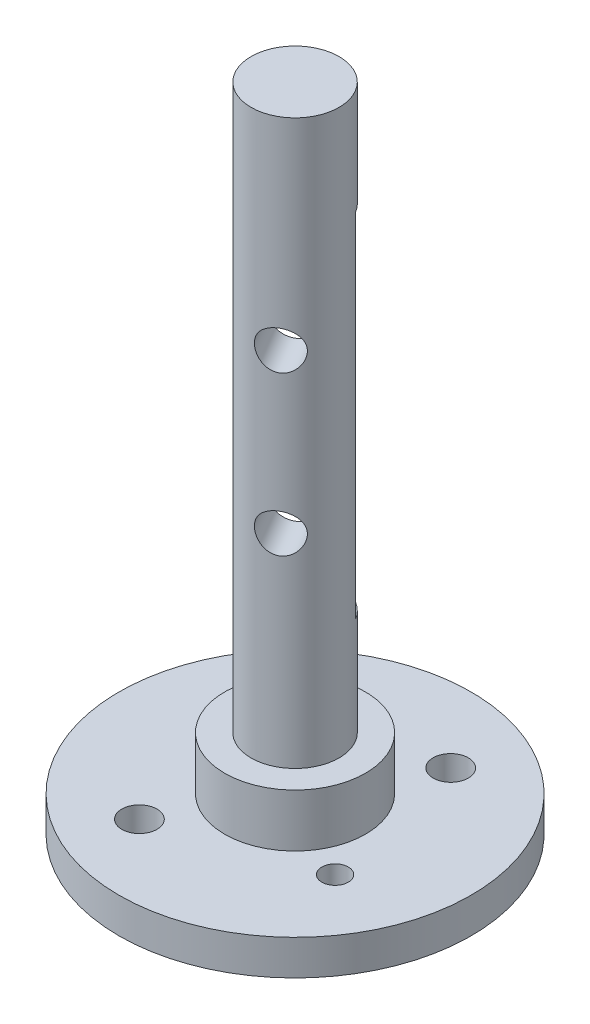
ISO-10303-21;
HEADER;
FILE_DESCRIPTION(('STEP AP214'),'2;1');
FILE_NAME('part.step','',(''),(''),'','','');
FILE_SCHEMA(('AUTOMOTIVE_DESIGN { 1 0 10303 214 1 1 1 1 }'));
ENDSEC;
DATA;
#1=APPLICATION_CONTEXT('core data for automotive mechanical design processes');
#2=APPLICATION_PROTOCOL_DEFINITION('international standard','automotive_design',2000,#1);
#3=PRODUCT_CONTEXT('',#1,'mechanical');
#4=PRODUCT('Part','Part','',(#3));
#5=PRODUCT_RELATED_PRODUCT_CATEGORY('part','',(#4));
#6=PRODUCT_DEFINITION_FORMATION('','',#4);
#7=PRODUCT_DEFINITION_CONTEXT('part definition',#1,'design');
#8=PRODUCT_DEFINITION('design','',#6,#7);
#9=PRODUCT_DEFINITION_SHAPE('','',#8);
#10=(LENGTH_UNIT() NAMED_UNIT(*) SI_UNIT(.MILLI.,.METRE.));
#11=(NAMED_UNIT(*) PLANE_ANGLE_UNIT() SI_UNIT($,.RADIAN.));
#12=(NAMED_UNIT(*) SI_UNIT($,.STERADIAN.) SOLID_ANGLE_UNIT());
#13=UNCERTAINTY_MEASURE_WITH_UNIT(LENGTH_MEASURE(1.E-05),#10,'distance_accuracy_value','');
#14=(GEOMETRIC_REPRESENTATION_CONTEXT(3) GLOBAL_UNCERTAINTY_ASSIGNED_CONTEXT((#13)) GLOBAL_UNIT_ASSIGNED_CONTEXT((#10,
#11,#12)) REPRESENTATION_CONTEXT('',''));
#15=CARTESIAN_POINT('',(0.,0.,0.));
#16=DIRECTION('',(0.,0.,1.));
#17=DIRECTION('',(1.,0.,0.));
#18=AXIS2_PLACEMENT_3D('',#15,#16,#17);
#19=CARTESIAN_POINT('',(0.,37.,0.));
#20=DIRECTION('',(0.,-1.,0.));
#21=DIRECTION('',(0.,0.,-1.));
#22=AXIS2_PLACEMENT_3D('',#19,#20,#21);
#23=CYLINDRICAL_SURFACE('',#22,2.5);
#24=CARTESIAN_POINT('',(0.,11.,0.));
#25=DIRECTION('',(0.,1.,0.));
#26=DIRECTION('',(0.,0.,1.));
#27=AXIS2_PLACEMENT_3D('',#24,#25,#26);
#28=CIRCLE('',#27,2.5);
#29=CARTESIAN_POINT('',(2.1577306350046,11.,-1.2626157399473));
#30=VERTEX_POINT('',#29);
#31=CARTESIAN_POINT('',(-2.1577306350046,11.,1.2626157399473));
#32=VERTEX_POINT('',#31);
#33=EDGE_CURVE('E75',#30,#32,#28,.T.);
#34=ORIENTED_EDGE('',*,*,#33,.F.);
#35=DIRECTION('',(0.,1.,0.));
#36=VECTOR('',#35,1.);
#37=CARTESIAN_POINT('',(2.1577306350046,11.,-1.2626157399473));
#38=LINE('',#37,#36);
#39=CARTESIAN_POINT('',(2.1577306350046,31.,-1.2626157399473));
#40=VERTEX_POINT('',#39);
#41=EDGE_CURVE('E60',#30,#40,#38,.T.);
#42=ORIENTED_EDGE('',*,*,#41,.T.);
#43=CARTESIAN_POINT('',(0.,31.,0.));
#44=DIRECTION('',(0.,1.,0.));
#45=DIRECTION('',(0.,0.,1.));
#46=AXIS2_PLACEMENT_3D('',#43,#44,#45);
#47=CIRCLE('',#46,2.5);
#48=CARTESIAN_POINT('',(-2.1577306350046,31.,1.2626157399473));
#49=VERTEX_POINT('',#48);
#50=EDGE_CURVE('E66',#40,#49,#47,.T.);
#51=ORIENTED_EDGE('',*,*,#50,.T.);
#52=DIRECTION('',(0.,1.,0.));
#53=VECTOR('',#52,1.);
#54=CARTESIAN_POINT('',(-2.1577306350046,11.,1.2626157399473));
#55=LINE('',#54,#53);
#56=EDGE_CURVE('E74',#32,#49,#55,.T.);
#57=ORIENTED_EDGE('',*,*,#56,.F.);
#58=EDGE_LOOP('',(#34,#42,#51,#57));
#59=FACE_BOUND('',#58,.T.);
#60=CARTESIAN_POINT('',(0.,5.,0.));
#61=DIRECTION('',(0.,1.,0.));
#62=DIRECTION('',(0.,0.,1.));
#63=AXIS2_PLACEMENT_3D('',#60,#61,#62);
#64=CIRCLE('',#63,2.5);
#65=CARTESIAN_POINT('',(0.,5.,2.5));
#66=VERTEX_POINT('',#65);
#67=EDGE_CURVE('E40',#66,#66,#64,.T.);
#68=ORIENTED_EDGE('',*,*,#67,.T.);
#69=EDGE_LOOP('',(#68));
#70=FACE_BOUND('',#69,.T.);
#71=CARTESIAN_POINT('',(0.,37.,0.));
#72=DIRECTION('',(0.,1.,0.));
#73=DIRECTION('',(0.,0.,1.));
#74=AXIS2_PLACEMENT_3D('',#71,#72,#73);
#75=CIRCLE('',#74,2.5);
#76=CARTESIAN_POINT('',(0.,37.,2.5));
#77=VERTEX_POINT('',#76);
#78=EDGE_CURVE('E119',#77,#77,#75,.T.);
#79=ORIENTED_EDGE('',*,*,#78,.F.);
#80=EDGE_LOOP('',(#79));
#81=FACE_BOUND('',#80,.T.);
#82=CARTESIAN_POINT('',(0.18442464300538,16.5,2.49318823016882));
#83=CARTESIAN_POINT('',(0.184434750697471,16.558325345306,2.49319093208037));
#84=CARTESIAN_POINT('',(0.189618534195267,16.616730956657,2.49282119394093));
#85=CARTESIAN_POINT('',(0.210038047667851,16.7318356309388,2.49118066961163));
#86=CARTESIAN_POINT('',(0.225299570137614,16.7885299236318,2.48990757077748));
#87=CARTESIAN_POINT('',(0.264844058072406,16.8983293844031,2.48601036048808));
#88=CARTESIAN_POINT('',(0.289087354979743,16.9514491385233,2.48339217033723));
#89=CARTESIAN_POINT('',(0.345376335311685,17.0531890817527,2.47619005324212));
#90=CARTESIAN_POINT('',(0.377420794669874,17.1018099751199,2.47160643460392));
#91=CARTESIAN_POINT('',(0.450284402547849,17.1965810830126,2.45940856145876));
#92=CARTESIAN_POINT('',(0.491529864061038,17.2423814102493,2.4516212106472));
#93=CARTESIAN_POINT('',(0.57992877369427,17.3269645463018,2.43222731145517));
#94=CARTESIAN_POINT('',(0.627084644264547,17.3657444616975,2.42061919389835));
#95=CARTESIAN_POINT('',(0.728223614520987,17.4370447262473,2.39219136625962));
#96=CARTESIAN_POINT('',(0.782428800540426,17.469161687624,2.37514272157507));
#97=CARTESIAN_POINT('',(0.893728105239973,17.5234668981569,2.33553642646199));
#98=CARTESIAN_POINT('',(0.950820785644777,17.5456600372448,2.31298149772636));
#99=CARTESIAN_POINT('',(1.06246006430458,17.578189214383,2.26377643066835));
#100=CARTESIAN_POINT('',(1.11696533626928,17.5891312495751,2.23743460915565));
#101=CARTESIAN_POINT('',(1.22472009893521,17.6008156666043,2.18031474184441));
#102=CARTESIAN_POINT('',(1.27797015072495,17.6015626953989,2.14953872364961));
#103=CARTESIAN_POINT('',(1.37792194017319,17.5931317480847,2.08676313036077));
#104=CARTESIAN_POINT('',(1.4248229228051,17.5846225000889,2.05498757123268));
#105=CARTESIAN_POINT('',(1.51483507021098,17.5590800076064,1.98956566547501));
#106=CARTESIAN_POINT('',(1.55794595417265,17.542046132146,1.9559191805276));
#107=CARTESIAN_POINT('',(1.64019633778255,17.4997508158519,1.8875020330883));
#108=CARTESIAN_POINT('',(1.67926511796416,17.4743676767526,1.85272204941347));
#109=CARTESIAN_POINT('',(1.7522093186193,17.4162227374928,1.78389494910953));
#110=CARTESIAN_POINT('',(1.78608284457971,17.3834582563376,1.74984810370032));
#111=CARTESIAN_POINT('',(1.85084046238111,17.3085446746648,1.68130348411901));
#112=CARTESIAN_POINT('',(1.88129109886321,17.2658659371704,1.64697427418423));
#113=CARTESIAN_POINT('',(1.93586237165086,17.1738052517502,1.58247450049678));
#114=CARTESIAN_POINT('',(1.95997997926089,17.1244201136342,1.55230592978281));
#115=CARTESIAN_POINT('',(2.00270029733647,17.0178669733776,1.49681970895768));
#116=CARTESIAN_POINT('',(2.02104262793908,16.9604660589339,1.47174553246187));
#117=CARTESIAN_POINT('',(2.05077275837354,16.8409936369972,1.43003313877434));
#118=CARTESIAN_POINT('',(2.06216619081302,16.7789259582371,1.41338809099849));
#119=CARTESIAN_POINT('',(2.07736849723177,16.6564963569089,1.39093950194394));
#120=CARTESIAN_POINT('',(2.08165145643396,16.5963179921052,1.38446004558039));
#121=CARTESIAN_POINT('',(2.08408045358699,16.4755667814109,1.38080262762296));
#122=CARTESIAN_POINT('',(2.08222905791236,16.4149941110651,1.38362077627208));
#123=CARTESIAN_POINT('',(2.07278979268871,16.2999744510811,1.39771339766535));
#124=CARTESIAN_POINT('',(2.06564248155054,16.24540871177,1.40833792870428));
#125=CARTESIAN_POINT('',(2.04618544195216,16.1390458926669,1.43645927489604));
#126=CARTESIAN_POINT('',(2.03387441021331,16.0872495155618,1.45395782492131));
#127=CARTESIAN_POINT('',(2.00348296735625,15.985315024106,1.49557542367725));
#128=CARTESIAN_POINT('',(1.98517056398052,15.9353527815072,1.51995403635327));
#129=CARTESIAN_POINT('',(1.94299916076226,15.8405989711233,1.57350399836508));
#130=CARTESIAN_POINT('',(1.91913758123439,15.7958098227297,1.60267757491471));
#131=CARTESIAN_POINT('',(1.86340208921761,15.7083434832694,1.66724709371894));
#132=CARTESIAN_POINT('',(1.83099034620297,15.6662473538417,1.70296918323724));
#133=CARTESIAN_POINT('',(1.75964720513562,15.5902491891778,1.77658854363006));
#134=CARTESIAN_POINT('',(1.72071496605469,15.5563482123507,1.81448609468554));
#135=CARTESIAN_POINT('',(1.63636171043851,15.4975812463636,1.89092026647818));
#136=CARTESIAN_POINT('',(1.59089439785953,15.472784635954,1.92945954631547));
#137=CARTESIAN_POINT('',(1.4945362152897,15.4336214892805,2.00501855707666));
#138=CARTESIAN_POINT('',(1.44364901253824,15.4192479512683,2.0420392922894));
#139=CARTESIAN_POINT('',(1.34190994054828,15.4022927377935,2.11015101278402));
#140=CARTESIAN_POINT('',(1.29135201028157,15.3988945431405,2.14147892862436));
#141=CARTESIAN_POINT('',(1.18832950845773,15.4017346743372,2.2003155813483));
#142=CARTESIAN_POINT('',(1.13586534590243,15.4079709447969,2.22782513146704));
#143=CARTESIAN_POINT('',(1.03300706911394,15.4293191791134,2.27728288057926));
#144=CARTESIAN_POINT('',(0.982620619323054,15.4440392317527,2.29941891926909));
#145=CARTESIAN_POINT('',(0.883156040378309,15.4814842492949,2.3394254904096));
#146=CARTESIAN_POINT('',(0.834078145659424,15.5042106383491,2.3572952630359));
#147=CARTESIAN_POINT('',(0.736421220023515,15.5581723526588,2.38965504100303));
#148=CARTESIAN_POINT('',(0.687968080202045,15.5897498381188,2.40395267286073));
#149=CARTESIAN_POINT('',(0.595410599055049,15.6600420188752,2.42853521322392));
#150=CARTESIAN_POINT('',(0.551308078877362,15.6987596837198,2.43881844660383));
#151=CARTESIAN_POINT('',(0.465606673601703,15.78573536284,2.4566789740198));
#152=CARTESIAN_POINT('',(0.424462571697035,15.8344986267506,2.46398670175658));
#153=CARTESIAN_POINT('',(0.350419747009711,15.9383134657133,2.47560411297386));
#154=CARTESIAN_POINT('',(0.317526065421395,15.9933688556396,2.47991196630437));
#155=CARTESIAN_POINT('',(0.261638863313972,16.1085846143773,2.48643155831661));
#156=CARTESIAN_POINT('',(0.238666851050271,16.1687557387487,2.48863875551709));
#157=CARTESIAN_POINT('',(0.204335595885528,16.2922346237686,2.49169745258048));
#158=CARTESIAN_POINT('',(0.192937392793503,16.3555311039897,2.4925535061461));
#159=CARTESIAN_POINT('',(0.185520528054144,16.4461016327264,2.49310616988991));
#160=CARTESIAN_POINT('',(0.184419971267794,16.4730422429305,2.49318698135538));
#161=CARTESIAN_POINT('',(0.18442464300538,16.5,2.49318823016882));
#162=B_SPLINE_CURVE_WITH_KNOTS('',3,(#82,#83,#84,#85,#86,#87,#88,#89,#90,#91,#92,#93,#94,#95,
#96,#97,#98,#99,#100,#101,#102,#103,#104,#105,#106,#107,#108,#109,#110,#111,#112,#113,#114,#115,
#116,#117,#118,#119,#120,#121,#122,#123,#124,#125,#126,#127,#128,#129,#130,#131,#132,#133,#134,
#135,#136,#137,#138,#139,#140,#141,#142,#143,#144,#145,#146,#147,#148,#149,#150,#151,#152,#153,
#154,#155,#156,#157,#158,#159,#160,#161),.UNSPECIFIED.,.T.,.F.,(4,2,2,2,2,2,2,2,2,2,2,2,2,2,2,2,
2,2,2,2,2,2,2,2,2,2,2,2,2,2,2,2,2,2,2,2,2,2,2,4),(0.,0.174891994667565,0.350233343674119,
0.524809343440102,0.699357968434042,0.884928681651844,1.07057570344714,1.26538500767087,
1.46009821416858,1.64366581372382,1.82714973904772,1.99820752306006,2.16927797025682,
2.34296144404576,2.51670810381827,2.70388470367641,2.89115065615067,3.08593731227327,
3.28056586850662,3.46160310705007,3.64256461624719,3.80995675731,3.97739117215506,
4.15226330196229,4.32721688891382,4.51839534153399,4.70959847179734,4.90222980302485,
5.09473161306757,5.27253594053548,5.45030234095709,5.62044885932699,5.79062565831862,
5.96859980397145,6.14664813538064,6.33841613542975,6.530301026192,6.722599823464,
6.91424912960411,6.99508355726004),.UNSPECIFIED.);
#163=CARTESIAN_POINT('',(0.18442464300538,16.5,2.49318823016882));
#164=VERTEX_POINT('',#163);
#165=EDGE_CURVE('E70',#164,#164,#162,.T.);
#166=ORIENTED_EDGE('',*,*,#165,.T.);
#167=EDGE_LOOP('',(#166));
#168=FACE_BOUND('',#167,.T.);
#169=CARTESIAN_POINT('',(0.18442464300538,25.5,2.49318823016882));
#170=CARTESIAN_POINT('',(0.184434750697471,25.441674654694,2.49319093208037));
#171=CARTESIAN_POINT('',(0.189618534195267,25.383269043343,2.49282119394093));
#172=CARTESIAN_POINT('',(0.210038047667851,25.2681643690612,2.49118066961163));
#173=CARTESIAN_POINT('',(0.225299570137614,25.2114700763682,2.48990757077748));
#174=CARTESIAN_POINT('',(0.264844058072406,25.1016706155969,2.48601036048808));
#175=CARTESIAN_POINT('',(0.289087354979743,25.0485508614767,2.48339217033723));
#176=CARTESIAN_POINT('',(0.345376335311684,24.9468109182473,2.47619005324212));
#177=CARTESIAN_POINT('',(0.377420794669873,24.8981900248801,2.47160643460392));
#178=CARTESIAN_POINT('',(0.450284402547849,24.8034189169875,2.45940856145876));
#179=CARTESIAN_POINT('',(0.491529864061038,24.7576185897507,2.4516212106472));
#180=CARTESIAN_POINT('',(0.57992877369427,24.6730354536982,2.43222731145517));
#181=CARTESIAN_POINT('',(0.627084644264547,24.6342555383025,2.42061919389835));
#182=CARTESIAN_POINT('',(0.728223614520987,24.5629552737527,2.39219136625962));
#183=CARTESIAN_POINT('',(0.782428800540426,24.530838312376,2.37514272157507));
#184=CARTESIAN_POINT('',(0.893728105239973,24.4765331018431,2.33553642646199));
#185=CARTESIAN_POINT('',(0.950820785644777,24.4543399627552,2.31298149772636));
#186=CARTESIAN_POINT('',(1.06246006430458,24.421810785617,2.26377643066835));
#187=CARTESIAN_POINT('',(1.11696533626928,24.410868750425,2.23743460915565));
#188=CARTESIAN_POINT('',(1.22472009893521,24.3991843333957,2.18031474184441));
#189=CARTESIAN_POINT('',(1.27797015072495,24.3984373046011,2.14953872364961));
#190=CARTESIAN_POINT('',(1.37792194017319,24.4068682519153,2.08676313036077));
#191=CARTESIAN_POINT('',(1.4248229228051,24.4153774999111,2.05498757123268));
#192=CARTESIAN_POINT('',(1.51483507021098,24.4409199923936,1.98956566547501));
#193=CARTESIAN_POINT('',(1.55794595417265,24.457953867854,1.9559191805276));
#194=CARTESIAN_POINT('',(1.64019633778255,24.5002491841481,1.8875020330883));
#195=CARTESIAN_POINT('',(1.67926511796416,24.5256323232474,1.85272204941347));
#196=CARTESIAN_POINT('',(1.7522093186193,24.5837772625072,1.78389494910953));
#197=CARTESIAN_POINT('',(1.78608284457971,24.6165417436624,1.74984810370032));
#198=CARTESIAN_POINT('',(1.85084046238111,24.6914553253352,1.68130348411901));
#199=CARTESIAN_POINT('',(1.88129109886321,24.7341340628296,1.64697427418423));
#200=CARTESIAN_POINT('',(1.93586237165086,24.8261947482498,1.58247450049678));
#201=CARTESIAN_POINT('',(1.95997997926089,24.8755798863658,1.55230592978281));
#202=CARTESIAN_POINT('',(2.00270029733647,24.9821330266224,1.49681970895768));
#203=CARTESIAN_POINT('',(2.02104262793908,25.0395339410661,1.47174553246187));
#204=CARTESIAN_POINT('',(2.05077275837354,25.1590063630028,1.43003313877434));
#205=CARTESIAN_POINT('',(2.06216619081302,25.2210740417629,1.41338809099849));
#206=CARTESIAN_POINT('',(2.07736849723177,25.3435036430912,1.39093950194394));
#207=CARTESIAN_POINT('',(2.08165145643396,25.4036820078948,1.38446004558039));
#208=CARTESIAN_POINT('',(2.08408045358699,25.5244332185891,1.38080262762296));
#209=CARTESIAN_POINT('',(2.08222905791236,25.5850058889349,1.38362077627208));
#210=CARTESIAN_POINT('',(2.07278979268871,25.700025548919,1.39771339766535));
#211=CARTESIAN_POINT('',(2.06564248155054,25.75459128823,1.40833792870428));
#212=CARTESIAN_POINT('',(2.04618544195216,25.8609541073331,1.43645927489604));
#213=CARTESIAN_POINT('',(2.03387441021331,25.9127504844382,1.45395782492131));
#214=CARTESIAN_POINT('',(2.00348296735625,26.014684975894,1.49557542367725));
#215=CARTESIAN_POINT('',(1.98517056398052,26.0646472184928,1.51995403635327));
#216=CARTESIAN_POINT('',(1.94299916076226,26.1594010288767,1.57350399836508));
#217=CARTESIAN_POINT('',(1.91913758123439,26.2041901772703,1.60267757491471));
#218=CARTESIAN_POINT('',(1.86340208921761,26.2916565167306,1.66724709371894));
#219=CARTESIAN_POINT('',(1.83099034620297,26.3337526461583,1.70296918323723));
#220=CARTESIAN_POINT('',(1.75964720513563,26.4097508108222,1.77658854363006));
#221=CARTESIAN_POINT('',(1.7207149660547,26.4436517876493,1.81448609468554));
#222=CARTESIAN_POINT('',(1.63636171043851,26.5024187536364,1.89092026647818));
#223=CARTESIAN_POINT('',(1.59089439785952,26.527215364046,1.92945954631547));
#224=CARTESIAN_POINT('',(1.4945362152897,26.5663785107195,2.00501855707666));
#225=CARTESIAN_POINT('',(1.44364901253824,26.5807520487317,2.0420392922894));
#226=CARTESIAN_POINT('',(1.34190994054828,26.5977072622065,2.11015101278402));
#227=CARTESIAN_POINT('',(1.29135201028157,26.6011054568595,2.14147892862436));
#228=CARTESIAN_POINT('',(1.18832950845773,26.5982653256628,2.2003155813483));
#229=CARTESIAN_POINT('',(1.13586534590243,26.5920290552031,2.22782513146704));
#230=CARTESIAN_POINT('',(1.03300706911394,26.5706808208866,2.27728288057926));
#231=CARTESIAN_POINT('',(0.982620619323054,26.5559607682473,2.29941891926909));
#232=CARTESIAN_POINT('',(0.88315604037831,26.5185157507052,2.3394254904096));
#233=CARTESIAN_POINT('',(0.834078145659424,26.4957893616509,2.3572952630359));
#234=CARTESIAN_POINT('',(0.736421220023515,26.4418276473412,2.38965504100303));
#235=CARTESIAN_POINT('',(0.687968080202046,26.4102501618812,2.40395267286073));
#236=CARTESIAN_POINT('',(0.595410599055049,26.3399579811249,2.42853521322392));
#237=CARTESIAN_POINT('',(0.551308078877362,26.3012403162802,2.43881844660383));
#238=CARTESIAN_POINT('',(0.465606673601703,26.21426463716,2.4566789740198));
#239=CARTESIAN_POINT('',(0.424462571697035,26.1655013732494,2.46398670175658));
#240=CARTESIAN_POINT('',(0.350419747009711,26.0616865342868,2.47560411297386));
#241=CARTESIAN_POINT('',(0.317526065421395,26.0066311443604,2.47991196630437));
#242=CARTESIAN_POINT('',(0.261638863313972,25.8914153856227,2.48643155831661));
#243=CARTESIAN_POINT('',(0.238666851050272,25.8312442612513,2.48863875551709));
#244=CARTESIAN_POINT('',(0.204335595885528,25.7077653762314,2.49169745258048));
#245=CARTESIAN_POINT('',(0.192937392793502,25.6444688960103,2.4925535061461));
#246=CARTESIAN_POINT('',(0.185520528054144,25.5538983672736,2.49310616988991));
#247=CARTESIAN_POINT('',(0.184419971267794,25.5269577570695,2.49318698135538));
#248=CARTESIAN_POINT('',(0.18442464300538,25.5,2.49318823016882));
#249=B_SPLINE_CURVE_WITH_KNOTS('',3,(#169,#170,#171,#172,#173,#174,#175,#176,#177,#178,#179,
#180,#181,#182,#183,#184,#185,#186,#187,#188,#189,#190,#191,#192,#193,#194,#195,#196,#197,#198,
#199,#200,#201,#202,#203,#204,#205,#206,#207,#208,#209,#210,#211,#212,#213,#214,#215,#216,#217,
#218,#219,#220,#221,#222,#223,#224,#225,#226,#227,#228,#229,#230,#231,#232,#233,#234,#235,#236,
#237,#238,#239,#240,#241,#242,#243,#244,#245,#246,#247,#248),.UNSPECIFIED.,.T.,.F.,(4,2,2,2,2,2,
2,2,2,2,2,2,2,2,2,2,2,2,2,2,2,2,2,2,2,2,2,2,2,2,2,2,2,2,2,2,2,2,2,4),(0.,0.174891994667565,
0.350233343674119,0.524809343440098,0.699357968434042,0.884928681651844,1.07057570344714,
1.26538500767087,1.46009821416858,1.64366581372382,1.82714973904772,1.99820752306006,
2.16927797025682,2.34296144404576,2.51670810381827,2.70388470367641,2.89115065615067,
3.08593731227327,3.28056586850662,3.46160310705007,3.64256461624719,3.80995675731,
3.97739117215506,4.15226330196229,4.32721688891382,4.51839534153398,4.70959847179734,
4.90222980302485,5.09473161306757,5.27253594053548,5.45030234095709,5.62044885932699,
5.79062565831863,5.96859980397145,6.14664813538064,6.33841613542975,6.530301026192,
6.722599823464,6.91424912960411,6.99508355726004),.UNSPECIFIED.);
#250=CARTESIAN_POINT('',(0.18442464300538,25.5,2.49318823016882));
#251=VERTEX_POINT('',#250);
#252=EDGE_CURVE('E158',#251,#251,#249,.T.);
#253=ORIENTED_EDGE('',*,*,#252,.F.);
#254=EDGE_LOOP('',(#253));
#255=FACE_BOUND('',#254,.T.);
#256=ADVANCED_FACE('F36',(#59,#70,#81,#168,#255),#23,.T.);
#257=CARTESIAN_POINT('',(2.1577306350046,11.,-1.2626157399473));
#258=DIRECTION('',(0.505046295978919,0.,0.863092254001839));
#259=DIRECTION('',(0.863092254001839,0.,-0.505046295978919));
#260=AXIS2_PLACEMENT_3D('',#257,#258,#259);
#261=PLANE('',#260);
#262=DIRECTION('',(0.863092254001839,0.,-0.505046295978919));
#263=VECTOR('',#262,1.);
#264=CARTESIAN_POINT('',(2.1577306350046,31.,-1.2626157399473));
#265=LINE('',#264,#263);
#266=EDGE_CURVE('E52',#49,#40,#265,.T.);
#267=ORIENTED_EDGE('',*,*,#266,.T.);
#268=ORIENTED_EDGE('',*,*,#41,.F.);
#269=DIRECTION('',(0.863092254001839,0.,-0.505046295978919));
#270=VECTOR('',#269,1.);
#271=CARTESIAN_POINT('',(2.1577306350046,11.,-1.2626157399473));
#272=LINE('',#271,#270);
#273=EDGE_CURVE('E84',#32,#30,#272,.T.);
#274=ORIENTED_EDGE('',*,*,#273,.F.);
#275=ORIENTED_EDGE('',*,*,#56,.T.);
#276=EDGE_LOOP('',(#267,#268,#274,#275));
#277=FACE_BOUND('',#276,.T.);
#278=CARTESIAN_POINT('',(0.,16.5,0.));
#279=DIRECTION('',(-0.505046295978918,0.,-0.863092254001839));
#280=DIRECTION('',(-0.863092254001839,0.,0.505046295978919));
#281=AXIS2_PLACEMENT_3D('',#278,#279,#280);
#282=CIRCLE('',#281,1.1);
#283=CARTESIAN_POINT('',(-0.949401479402022,16.5,0.555550925576812));
#284=VERTEX_POINT('',#283);
#285=EDGE_CURVE('E164',#284,#284,#282,.T.);
#286=ORIENTED_EDGE('',*,*,#285,.F.);
#287=EDGE_LOOP('',(#286));
#288=FACE_BOUND('',#287,.T.);
#289=CARTESIAN_POINT('',(0.,25.5,0.));
#290=DIRECTION('',(0.505046295978918,0.,0.863092254001839));
#291=DIRECTION('',(-0.863092254001839,0.,0.505046295978919));
#292=AXIS2_PLACEMENT_3D('',#289,#290,#291);
#293=CIRCLE('',#292,1.1);
#294=CARTESIAN_POINT('',(-0.949401479402022,25.5,0.555550925576812));
#295=VERTEX_POINT('',#294);
#296=EDGE_CURVE('E165',#295,#295,#293,.T.);
#297=ORIENTED_EDGE('',*,*,#296,.T.);
#298=EDGE_LOOP('',(#297));
#299=FACE_BOUND('',#298,.T.);
#300=ADVANCED_FACE('F72',(#277,#288,#299),#261,.F.);
#301=CARTESIAN_POINT('',(0.,2.,0.));
#302=DIRECTION('',(0.,1.,0.));
#303=DIRECTION('',(0.,0.,1.));
#304=AXIS2_PLACEMENT_3D('',#301,#302,#303);
#305=PLANE('',#304);
#306=CARTESIAN_POINT('',(0.,2.,0.));
#307=DIRECTION('',(0.,1.,0.));
#308=DIRECTION('',(0.,0.,1.));
#309=AXIS2_PLACEMENT_3D('',#306,#307,#308);
#310=CIRCLE('',#309,10.);
#311=CARTESIAN_POINT('',(0.,2.,10.));
#312=VERTEX_POINT('',#311);
#313=EDGE_CURVE('E11',#312,#312,#310,.T.);
#314=ORIENTED_EDGE('',*,*,#313,.T.);
#315=EDGE_LOOP('',(#314));
#316=FACE_BOUND('',#315,.T.);
#317=CARTESIAN_POINT('',(-3.15926405961951,2.,5.68058541011368));
#318=DIRECTION('',(0.,1.,0.));
#319=DIRECTION('',(0.,0.,1.));
#320=AXIS2_PLACEMENT_3D('',#317,#318,#319);
#321=CIRCLE('',#320,1.);
#322=CARTESIAN_POINT('',(-3.15926405961951,2.,6.68058541011368));
#323=VERTEX_POINT('',#322);
#324=EDGE_CURVE('E116',#323,#323,#321,.T.);
#325=ORIENTED_EDGE('',*,*,#324,.F.);
#326=EDGE_LOOP('',(#325));
#327=FACE_BOUND('',#326,.T.);
#328=CARTESIAN_POINT('',(3.15926405961952,2.,-5.68058541011368));
#329=DIRECTION('',(0.,1.,0.));
#330=DIRECTION('',(0.,0.,1.));
#331=AXIS2_PLACEMENT_3D('',#328,#329,#330);
#332=CIRCLE('',#331,1.);
#333=CARTESIAN_POINT('',(3.15926405961952,2.,-4.68058541011368));
#334=VERTEX_POINT('',#333);
#335=EDGE_CURVE('E110',#334,#334,#332,.T.);
#336=ORIENTED_EDGE('',*,*,#335,.F.);
#337=EDGE_LOOP('',(#336));
#338=FACE_BOUND('',#337,.T.);
#339=CARTESIAN_POINT('',(5.12126623127172,2.,2.84819805990313));
#340=DIRECTION('',(0.,1.,0.));
#341=DIRECTION('',(0.,0.,1.));
#342=AXIS2_PLACEMENT_3D('',#339,#340,#341);
#343=CIRCLE('',#342,0.75);
#344=CARTESIAN_POINT('',(5.12126623127172,2.,3.59819805990313));
#345=VERTEX_POINT('',#344);
#346=EDGE_CURVE('E104',#345,#345,#343,.T.);
#347=ORIENTED_EDGE('',*,*,#346,.F.);
#348=EDGE_LOOP('',(#347));
#349=FACE_BOUND('',#348,.T.);
#350=CARTESIAN_POINT('',(-5.12126623127172,2.,-2.84819805990313));
#351=DIRECTION('',(0.,1.,0.));
#352=DIRECTION('',(0.,0.,1.));
#353=AXIS2_PLACEMENT_3D('',#350,#351,#352);
#354=CIRCLE('',#353,0.750000000000001);
#355=CARTESIAN_POINT('',(-5.12126623127172,2.,-2.09819805990313));
#356=VERTEX_POINT('',#355);
#357=EDGE_CURVE('E98',#356,#356,#354,.T.);
#358=ORIENTED_EDGE('',*,*,#357,.F.);
#359=EDGE_LOOP('',(#358));
#360=FACE_BOUND('',#359,.T.);
#361=CARTESIAN_POINT('',(0.,2.,0.));
#362=DIRECTION('',(0.,1.,0.));
#363=DIRECTION('',(0.,0.,1.));
#364=AXIS2_PLACEMENT_3D('',#361,#362,#363);
#365=CIRCLE('',#364,4.);
#366=CARTESIAN_POINT('',(0.,2.,4.));
#367=VERTEX_POINT('',#366);
#368=EDGE_CURVE('E79',#367,#367,#365,.T.);
#369=ORIENTED_EDGE('',*,*,#368,.F.);
#370=EDGE_LOOP('',(#369));
#371=FACE_BOUND('',#370,.T.);
#372=ADVANCED_FACE('F136',(#316,#327,#338,#349,#360,#371),#305,.T.);
#373=CARTESIAN_POINT('',(0.,2.,0.));
#374=DIRECTION('',(0.,-1.,0.));
#375=DIRECTION('',(0.,0.,-1.));
#376=AXIS2_PLACEMENT_3D('',#373,#374,#375);
#377=CYLINDRICAL_SURFACE('',#376,10.);
#378=ORIENTED_EDGE('',*,*,#313,.F.);
#379=EDGE_LOOP('',(#378));
#380=FACE_BOUND('',#379,.T.);
#381=CARTESIAN_POINT('',(0.,0.,0.));
#382=DIRECTION('',(0.,1.,0.));
#383=DIRECTION('',(0.,0.,1.));
#384=AXIS2_PLACEMENT_3D('',#381,#382,#383);
#385=CIRCLE('',#384,10.);
#386=CARTESIAN_POINT('',(0.,0.,10.));
#387=VERTEX_POINT('',#386);
#388=EDGE_CURVE('E45',#387,#387,#385,.T.);
#389=ORIENTED_EDGE('',*,*,#388,.T.);
#390=EDGE_LOOP('',(#389));
#391=FACE_BOUND('',#390,.T.);
#392=ADVANCED_FACE('F38',(#380,#391),#377,.T.);
#393=CARTESIAN_POINT('',(0.,0.,0.));
#394=DIRECTION('',(0.,1.,0.));
#395=DIRECTION('',(0.,0.,1.));
#396=AXIS2_PLACEMENT_3D('',#393,#394,#395);
#397=PLANE('',#396);
#398=CARTESIAN_POINT('',(0.,0.,0.));
#399=DIRECTION('',(0.,-1.,0.));
#400=DIRECTION('',(0.,0.,-1.));
#401=AXIS2_PLACEMENT_3D('',#398,#399,#400);
#402=CIRCLE('',#401,3.5);
#403=CARTESIAN_POINT('',(0.,0.,-3.5));
#404=VERTEX_POINT('',#403);
#405=EDGE_CURVE('E93',#404,#404,#402,.T.);
#406=ORIENTED_EDGE('',*,*,#405,.F.);
#407=EDGE_LOOP('',(#406));
#408=FACE_BOUND('',#407,.T.);
#409=CARTESIAN_POINT('',(-5.12126623127172,0.,-2.84819805990313));
#410=DIRECTION('',(0.,-1.,0.));
#411=DIRECTION('',(0.,0.,1.));
#412=AXIS2_PLACEMENT_3D('',#409,#410,#411);
#413=CIRCLE('',#412,0.750000000000001);
#414=CARTESIAN_POINT('',(-5.12126623127172,0.,-2.09819805990313));
#415=VERTEX_POINT('',#414);
#416=EDGE_CURVE('E92',#415,#415,#413,.T.);
#417=ORIENTED_EDGE('',*,*,#416,.F.);
#418=EDGE_LOOP('',(#417));
#419=FACE_BOUND('',#418,.T.);
#420=CARTESIAN_POINT('',(5.12126623127172,0.,2.84819805990313));
#421=DIRECTION('',(0.,-1.,0.));
#422=DIRECTION('',(0.,0.,-1.));
#423=AXIS2_PLACEMENT_3D('',#420,#421,#422);
#424=CIRCLE('',#423,0.75);
#425=CARTESIAN_POINT('',(5.12126623127172,0.,2.09819805990313));
#426=VERTEX_POINT('',#425);
#427=EDGE_CURVE('E101',#426,#426,#424,.T.);
#428=ORIENTED_EDGE('',*,*,#427,.F.);
#429=EDGE_LOOP('',(#428));
#430=FACE_BOUND('',#429,.T.);
#431=CARTESIAN_POINT('',(3.15926405961952,0.,-5.68058541011368));
#432=DIRECTION('',(0.,-1.,0.));
#433=DIRECTION('',(0.,0.,1.));
#434=AXIS2_PLACEMENT_3D('',#431,#432,#433);
#435=CIRCLE('',#434,1.);
#436=CARTESIAN_POINT('',(3.15926405961952,0.,-4.68058541011368));
#437=VERTEX_POINT('',#436);
#438=EDGE_CURVE('E107',#437,#437,#435,.T.);
#439=ORIENTED_EDGE('',*,*,#438,.F.);
#440=EDGE_LOOP('',(#439));
#441=FACE_BOUND('',#440,.T.);
#442=CARTESIAN_POINT('',(-3.15926405961951,0.,5.68058541011368));
#443=DIRECTION('',(0.,-1.,0.));
#444=DIRECTION('',(0.,0.,-1.));
#445=AXIS2_PLACEMENT_3D('',#442,#443,#444);
#446=CIRCLE('',#445,1.);
#447=CARTESIAN_POINT('',(-3.15926405961951,0.,4.68058541011368));
#448=VERTEX_POINT('',#447);
#449=EDGE_CURVE('E113',#448,#448,#446,.T.);
#450=ORIENTED_EDGE('',*,*,#449,.F.);
#451=EDGE_LOOP('',(#450));
#452=FACE_BOUND('',#451,.T.);
#453=ORIENTED_EDGE('',*,*,#388,.F.);
#454=EDGE_LOOP('',(#453));
#455=FACE_BOUND('',#454,.T.);
#456=ADVANCED_FACE('F125',(#408,#419,#430,#441,#452,#455),#397,.F.);
#457=CARTESIAN_POINT('',(-3.15926405961951,3.,5.68058541011368));
#458=DIRECTION('',(0.,-1.,0.));
#459=DIRECTION('',(0.,0.,-1.));
#460=AXIS2_PLACEMENT_3D('',#457,#458,#459);
#461=CYLINDRICAL_SURFACE('',#460,1.);
#462=ORIENTED_EDGE('',*,*,#324,.T.);
#463=EDGE_LOOP('',(#462));
#464=FACE_BOUND('',#463,.T.);
#465=ORIENTED_EDGE('',*,*,#449,.T.);
#466=EDGE_LOOP('',(#465));
#467=FACE_BOUND('',#466,.T.);
#468=ADVANCED_FACE('F127',(#464,#467),#461,.F.);
#469=CARTESIAN_POINT('',(3.15926405961952,3.,-5.68058541011368));
#470=DIRECTION('',(0.,-1.,0.));
#471=DIRECTION('',(0.,0.,-1.));
#472=AXIS2_PLACEMENT_3D('',#469,#470,#471);
#473=CYLINDRICAL_SURFACE('',#472,1.);
#474=ORIENTED_EDGE('',*,*,#335,.T.);
#475=EDGE_LOOP('',(#474));
#476=FACE_BOUND('',#475,.T.);
#477=ORIENTED_EDGE('',*,*,#438,.T.);
#478=EDGE_LOOP('',(#477));
#479=FACE_BOUND('',#478,.T.);
#480=ADVANCED_FACE('F133',(#476,#479),#473,.F.);
#481=CARTESIAN_POINT('',(5.12126623127172,3.,2.84819805990313));
#482=DIRECTION('',(0.,-1.,0.));
#483=DIRECTION('',(0.,0.,-1.));
#484=AXIS2_PLACEMENT_3D('',#481,#482,#483);
#485=CYLINDRICAL_SURFACE('',#484,0.75);
#486=ORIENTED_EDGE('',*,*,#346,.T.);
#487=EDGE_LOOP('',(#486));
#488=FACE_BOUND('',#487,.T.);
#489=ORIENTED_EDGE('',*,*,#427,.T.);
#490=EDGE_LOOP('',(#489));
#491=FACE_BOUND('',#490,.T.);
#492=ADVANCED_FACE('F200',(#488,#491),#485,.F.);
#493=CARTESIAN_POINT('',(-5.12126623127172,3.,-2.84819805990313));
#494=DIRECTION('',(0.,-1.,0.));
#495=DIRECTION('',(0.,0.,-1.));
#496=AXIS2_PLACEMENT_3D('',#493,#494,#495);
#497=CYLINDRICAL_SURFACE('',#496,0.750000000000001);
#498=ORIENTED_EDGE('',*,*,#357,.T.);
#499=EDGE_LOOP('',(#498));
#500=FACE_BOUND('',#499,.T.);
#501=ORIENTED_EDGE('',*,*,#416,.T.);
#502=EDGE_LOOP('',(#501));
#503=FACE_BOUND('',#502,.T.);
#504=ADVANCED_FACE('F196',(#500,#503),#497,.F.);
#505=CARTESIAN_POINT('',(0.,1.,0.));
#506=DIRECTION('',(0.,-1.,0.));
#507=DIRECTION('',(0.,0.,-1.));
#508=AXIS2_PLACEMENT_3D('',#505,#506,#507);
#509=CYLINDRICAL_SURFACE('',#508,3.5);
#510=CARTESIAN_POINT('',(0.,1.,0.));
#511=DIRECTION('',(0.,-1.,0.));
#512=DIRECTION('',(0.,0.,-1.));
#513=AXIS2_PLACEMENT_3D('',#510,#511,#512);
#514=CIRCLE('',#513,3.5);
#515=CARTESIAN_POINT('',(0.,1.,-3.5));
#516=VERTEX_POINT('',#515);
#517=EDGE_CURVE('E89',#516,#516,#514,.T.);
#518=ORIENTED_EDGE('',*,*,#517,.F.);
#519=EDGE_LOOP('',(#518));
#520=FACE_BOUND('',#519,.T.);
#521=ORIENTED_EDGE('',*,*,#405,.T.);
#522=EDGE_LOOP('',(#521));
#523=FACE_BOUND('',#522,.T.);
#524=ADVANCED_FACE('F192',(#520,#523),#509,.F.);
#525=CARTESIAN_POINT('',(0.,1.,0.));
#526=DIRECTION('',(0.,-1.,0.));
#527=DIRECTION('',(0.,0.,-1.));
#528=AXIS2_PLACEMENT_3D('',#525,#526,#527);
#529=PLANE('',#528);
#530=ORIENTED_EDGE('',*,*,#517,.T.);
#531=EDGE_LOOP('',(#530));
#532=FACE_BOUND('',#531,.T.);
#533=ADVANCED_FACE('F185',(#532),#529,.T.);
#534=CARTESIAN_POINT('',(0.,5.,0.));
#535=DIRECTION('',(0.,1.,0.));
#536=DIRECTION('',(0.,0.,1.));
#537=AXIS2_PLACEMENT_3D('',#534,#535,#536);
#538=PLANE('',#537);
#539=CARTESIAN_POINT('',(0.,5.,0.));
#540=DIRECTION('',(0.,1.,0.));
#541=DIRECTION('',(0.,0.,1.));
#542=AXIS2_PLACEMENT_3D('',#539,#540,#541);
#543=CIRCLE('',#542,4.);
#544=CARTESIAN_POINT('',(0.,5.,4.));
#545=VERTEX_POINT('',#544);
#546=EDGE_CURVE('E82',#545,#545,#543,.T.);
#547=ORIENTED_EDGE('',*,*,#546,.T.);
#548=EDGE_LOOP('',(#547));
#549=FACE_BOUND('',#548,.T.);
#550=ORIENTED_EDGE('',*,*,#67,.F.);
#551=EDGE_LOOP('',(#550));
#552=FACE_BOUND('',#551,.T.);
#553=ADVANCED_FACE('F181',(#549,#552),#538,.T.);
#554=CARTESIAN_POINT('',(0.,5.,0.));
#555=DIRECTION('',(0.,-1.,0.));
#556=DIRECTION('',(0.,0.,-1.));
#557=AXIS2_PLACEMENT_3D('',#554,#555,#556);
#558=CYLINDRICAL_SURFACE('',#557,4.);
#559=ORIENTED_EDGE('',*,*,#546,.F.);
#560=EDGE_LOOP('',(#559));
#561=FACE_BOUND('',#560,.T.);
#562=ORIENTED_EDGE('',*,*,#368,.T.);
#563=EDGE_LOOP('',(#562));
#564=FACE_BOUND('',#563,.T.);
#565=ADVANCED_FACE('F184',(#561,#564),#558,.T.);
#566=CARTESIAN_POINT('',(0.,37.,0.));
#567=DIRECTION('',(0.,1.,0.));
#568=DIRECTION('',(0.,0.,1.));
#569=AXIS2_PLACEMENT_3D('',#566,#567,#568);
#570=PLANE('',#569);
#571=ORIENTED_EDGE('',*,*,#78,.T.);
#572=EDGE_LOOP('',(#571));
#573=FACE_BOUND('',#572,.T.);
#574=ADVANCED_FACE('F149',(#573),#570,.T.);
#575=CARTESIAN_POINT('',(0.,11.,0.));
#576=DIRECTION('',(0.,1.,0.));
#577=DIRECTION('',(0.,0.,1.));
#578=AXIS2_PLACEMENT_3D('',#575,#576,#577);
#579=PLANE('',#578);
#580=ORIENTED_EDGE('',*,*,#33,.T.);
#581=ORIENTED_EDGE('',*,*,#273,.T.);
#582=EDGE_LOOP('',(#580,#581));
#583=FACE_BOUND('',#582,.T.);
#584=ADVANCED_FACE('F175',(#583),#579,.T.);
#585=CARTESIAN_POINT('',(0.,31.,0.));
#586=DIRECTION('',(0.,1.,0.));
#587=DIRECTION('',(0.,0.,1.));
#588=AXIS2_PLACEMENT_3D('',#585,#586,#587);
#589=PLANE('',#588);
#590=ORIENTED_EDGE('',*,*,#50,.F.);
#591=ORIENTED_EDGE('',*,*,#266,.F.);
#592=EDGE_LOOP('',(#590,#591));
#593=FACE_BOUND('',#592,.T.);
#594=ADVANCED_FACE('F67',(#593),#589,.F.);
#595=CARTESIAN_POINT('',(1.51513888793676,16.5,2.58927676200552));
#596=DIRECTION('',(-0.505046295978918,0.,-0.863092254001839));
#597=DIRECTION('',(-0.863092254001839,0.,0.505046295978919));
#598=AXIS2_PLACEMENT_3D('',#595,#596,#597);
#599=CYLINDRICAL_SURFACE('',#598,1.1);
#600=ORIENTED_EDGE('',*,*,#285,.T.);
#601=EDGE_LOOP('',(#600));
#602=FACE_BOUND('',#601,.T.);
#603=ORIENTED_EDGE('',*,*,#165,.F.);
#604=EDGE_LOOP('',(#603));
#605=FACE_BOUND('',#604,.T.);
#606=ADVANCED_FACE('F169',(#602,#605),#599,.F.);
#607=CARTESIAN_POINT('',(1.51513888793676,25.5,2.58927676200552));
#608=DIRECTION('',(-0.505046295978918,0.,-0.863092254001839));
#609=DIRECTION('',(-0.863092254001839,0.,0.505046295978919));
#610=AXIS2_PLACEMENT_3D('',#607,#608,#609);
#611=CYLINDRICAL_SURFACE('',#610,1.1);
#612=ORIENTED_EDGE('',*,*,#296,.F.);
#613=EDGE_LOOP('',(#612));
#614=FACE_BOUND('',#613,.T.);
#615=ORIENTED_EDGE('',*,*,#252,.T.);
#616=EDGE_LOOP('',(#615));
#617=FACE_BOUND('',#616,.T.);
#618=ADVANCED_FACE('F166',(#614,#617),#611,.F.);
#619=CLOSED_SHELL('',(#256,#300,#372,#392,#456,#468,#480,#492,#504,#524,#533,#553,#565,#574,
#584,#594,#606,#618));
#620=MANIFOLD_SOLID_BREP('B2',#619);
#621=ADVANCED_BREP_SHAPE_REPRESENTATION('',(#18,#620),#14);
#622=SHAPE_DEFINITION_REPRESENTATION(#9,#621);
ENDSEC;
END-ISO-10303-21;
